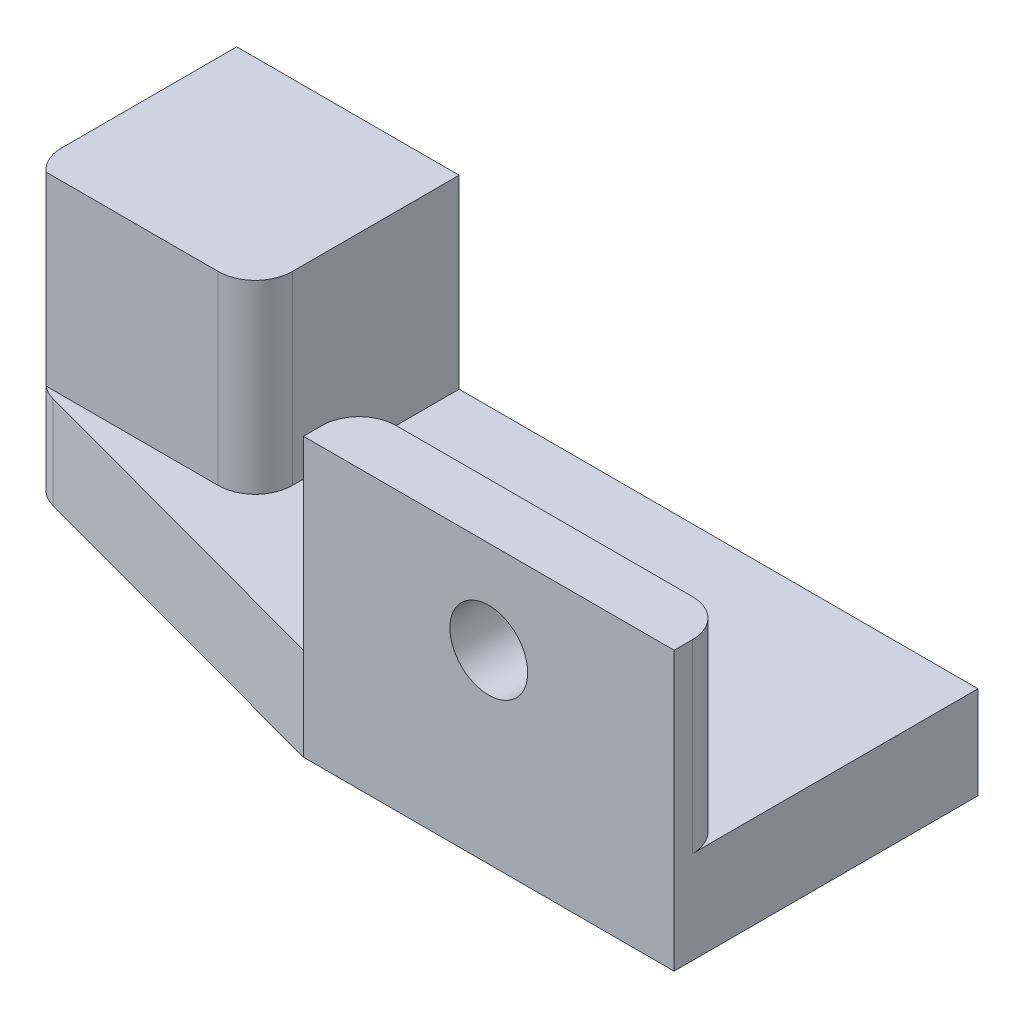
ISO-10303-21;
HEADER;
FILE_DESCRIPTION(('STEP AP214'),'2;1');
FILE_NAME('part.step','',(''),(''),'','','');
FILE_SCHEMA(('AUTOMOTIVE_DESIGN { 1 0 10303 214 1 1 1 1 }'));
ENDSEC;
DATA;
#1=APPLICATION_CONTEXT('core data for automotive mechanical design processes');
#2=APPLICATION_PROTOCOL_DEFINITION('international standard','automotive_design',2000,#1);
#3=PRODUCT_CONTEXT('',#1,'mechanical');
#4=PRODUCT('Part','Part','',(#3));
#5=PRODUCT_RELATED_PRODUCT_CATEGORY('part','',(#4));
#6=PRODUCT_DEFINITION_FORMATION('','',#4);
#7=PRODUCT_DEFINITION_CONTEXT('part definition',#1,'design');
#8=PRODUCT_DEFINITION('design','',#6,#7);
#9=PRODUCT_DEFINITION_SHAPE('','',#8);
#10=(LENGTH_UNIT() NAMED_UNIT(*) SI_UNIT(.MILLI.,.METRE.));
#11=(NAMED_UNIT(*) PLANE_ANGLE_UNIT() SI_UNIT($,.RADIAN.));
#12=(NAMED_UNIT(*) SI_UNIT($,.STERADIAN.) SOLID_ANGLE_UNIT());
#13=UNCERTAINTY_MEASURE_WITH_UNIT(LENGTH_MEASURE(1.E-05),#10,'distance_accuracy_value','');
#14=(GEOMETRIC_REPRESENTATION_CONTEXT(3) GLOBAL_UNCERTAINTY_ASSIGNED_CONTEXT((#13)) GLOBAL_UNIT_ASSIGNED_CONTEXT((#10,
#11,#12)) REPRESENTATION_CONTEXT('',''));
#15=CARTESIAN_POINT('',(0.,0.,0.));
#16=DIRECTION('',(0.,0.,1.));
#17=DIRECTION('',(1.,0.,0.));
#18=AXIS2_PLACEMENT_3D('',#15,#16,#17);
#19=CARTESIAN_POINT('',(0.,5.,0.));
#20=DIRECTION('',(0.,-1.,0.));
#21=DIRECTION('',(0.,0.,1.));
#22=AXIS2_PLACEMENT_3D('',#19,#20,#21);
#23=PLANE('',#22);
#24=CARTESIAN_POINT('',(0.,5.,-8.2));
#25=DIRECTION('',(0.,-1.,0.));
#26=DIRECTION('',(0.,0.,-1.));
#27=AXIS2_PLACEMENT_3D('',#24,#25,#26);
#28=CIRCLE('',#27,2.1);
#29=CARTESIAN_POINT('',(0.,5.,-10.3));
#30=VERTEX_POINT('',#29);
#31=EDGE_CURVE('E206',#30,#30,#28,.T.);
#32=ORIENTED_EDGE('',*,*,#31,.T.);
#33=EDGE_LOOP('',(#32));
#34=FACE_BOUND('',#33,.T.);
#35=DIRECTION('',(-0.965429082558387,0.,-0.260665852290765));
#36=VECTOR('',#35,1.);
#37=CARTESIAN_POINT('',(-20.,5.,-5.40000000000001));
#38=LINE('',#37,#36);
#39=CARTESIAN_POINT('',(0.,5.,0.));
#40=VERTEX_POINT('',#39);
#41=CARTESIAN_POINT('',(-18.5213317045815,5.,-5.00075956023702));
#42=VERTEX_POINT('',#41);
#43=EDGE_CURVE('E212',#40,#42,#38,.T.);
#44=ORIENTED_EDGE('',*,*,#43,.F.);
#45=DIRECTION('',(0.,0.,-1.));
#46=VECTOR('',#45,1.);
#47=CARTESIAN_POINT('',(0.,5.,0.));
#48=LINE('',#47,#46);
#49=CARTESIAN_POINT('',(0.,5.,-1.));
#50=VERTEX_POINT('',#49);
#51=EDGE_CURVE('E178',#40,#50,#48,.T.);
#52=ORIENTED_EDGE('',*,*,#51,.T.);
#53=CARTESIAN_POINT('',(2.,5.,-1.));
#54=DIRECTION('',(0.,1.,0.));
#55=DIRECTION('',(0.,0.,1.));
#56=AXIS2_PLACEMENT_3D('',#53,#54,#55);
#57=CIRCLE('',#56,2.);
#58=CARTESIAN_POINT('',(2.,5.,-3.));
#59=VERTEX_POINT('',#58);
#60=EDGE_CURVE('E11',#59,#50,#57,.T.);
#61=ORIENTED_EDGE('',*,*,#60,.F.);
#62=DIRECTION('',(1.,0.,0.));
#63=VECTOR('',#62,1.);
#64=CARTESIAN_POINT('',(0.,5.,-3.));
#65=LINE('',#64,#63);
#66=CARTESIAN_POINT('',(18.,5.,-3.));
#67=VERTEX_POINT('',#66);
#68=EDGE_CURVE('E181',#59,#67,#65,.T.);
#69=ORIENTED_EDGE('',*,*,#68,.T.);
#70=CARTESIAN_POINT('',(18.,5.,-1.));
#71=DIRECTION('',(0.,1.,0.));
#72=DIRECTION('',(0.,0.,1.));
#73=AXIS2_PLACEMENT_3D('',#70,#71,#72);
#74=CIRCLE('',#73,2.);
#75=CARTESIAN_POINT('',(20.,5.,-1.));
#76=VERTEX_POINT('',#75);
#77=EDGE_CURVE('E49',#76,#67,#74,.T.);
#78=ORIENTED_EDGE('',*,*,#77,.F.);
#79=DIRECTION('',(0.,0.,1.));
#80=VECTOR('',#79,1.);
#81=CARTESIAN_POINT('',(20.,5.,0.));
#82=LINE('',#81,#80);
#83=CARTESIAN_POINT('',(20.,5.,-16.4));
#84=VERTEX_POINT('',#83);
#85=EDGE_CURVE('E217',#84,#76,#82,.T.);
#86=ORIENTED_EDGE('',*,*,#85,.F.);
#87=DIRECTION('',(1.,0.,0.));
#88=VECTOR('',#87,1.);
#89=CARTESIAN_POINT('',(20.,5.,-16.4));
#90=LINE('',#89,#88);
#91=CARTESIAN_POINT('',(-8.,5.,-16.4));
#92=VERTEX_POINT('',#91);
#93=EDGE_CURVE('E214',#92,#84,#90,.T.);
#94=ORIENTED_EDGE('',*,*,#93,.F.);
#95=DIRECTION('',(0.,0.,-1.));
#96=VECTOR('',#95,1.);
#97=CARTESIAN_POINT('',(-8.,5.,0.));
#98=LINE('',#97,#96);
#99=CARTESIAN_POINT('',(-7.99999999999999,5.,-7.40000000000001));
#100=VERTEX_POINT('',#99);
#101=EDGE_CURVE('E186',#100,#92,#98,.T.);
#102=ORIENTED_EDGE('',*,*,#101,.F.);
#103=CARTESIAN_POINT('',(-9.99999999999999,5.,-7.40000000000001));
#104=DIRECTION('',(0.,1.,0.));
#105=DIRECTION('',(0.,0.,1.));
#106=AXIS2_PLACEMENT_3D('',#103,#104,#105);
#107=CIRCLE('',#106,2.);
#108=CARTESIAN_POINT('',(-9.99999999999999,5.,-5.40000000000001));
#109=VERTEX_POINT('',#108);
#110=EDGE_CURVE('E266',#109,#100,#107,.T.);
#111=ORIENTED_EDGE('',*,*,#110,.F.);
#112=DIRECTION('',(1.,0.,0.));
#113=VECTOR('',#112,1.);
#114=CARTESIAN_POINT('',(0.,5.,-5.40000000000001));
#115=LINE('',#114,#113);
#116=CARTESIAN_POINT('',(-19.2861365181745,5.,-5.40000000000001));
#117=VERTEX_POINT('',#116);
#118=EDGE_CURVE('E190',#117,#109,#115,.T.);
#119=ORIENTED_EDGE('',*,*,#118,.F.);
#120=CARTESIAN_POINT('',(-18.,5.,-6.93161772535379));
#121=DIRECTION('',(0.,1.,0.));
#122=DIRECTION('',(0.,0.,1.));
#123=AXIS2_PLACEMENT_3D('',#120,#121,#122);
#124=CIRCLE('',#123,2.);
#125=EDGE_CURVE('E264',#42,#117,#124,.F.);
#126=ORIENTED_EDGE('',*,*,#125,.F.);
#127=EDGE_LOOP('',(#44,#52,#61,#69,#78,#86,#94,#102,#111,#119,#126));
#128=FACE_BOUND('',#127,.T.);
#129=ADVANCED_FACE('F41',(#34,#128),#23,.F.);
#130=CARTESIAN_POINT('',(0.,0.,0.));
#131=DIRECTION('',(0.,-1.,0.));
#132=DIRECTION('',(0.,0.,1.));
#133=AXIS2_PLACEMENT_3D('',#130,#131,#132);
#134=PLANE('',#133);
#135=DIRECTION('',(0.,0.,-1.));
#136=VECTOR('',#135,1.);
#137=CARTESIAN_POINT('',(-20.,0.,-16.4));
#138=LINE('',#137,#136);
#139=CARTESIAN_POINT('',(-20.,0.,-6.93161772535379));
#140=VERTEX_POINT('',#139);
#141=CARTESIAN_POINT('',(-20.,0.,-16.4));
#142=VERTEX_POINT('',#141);
#143=EDGE_CURVE('E221',#140,#142,#138,.T.);
#144=ORIENTED_EDGE('',*,*,#143,.T.);
#145=DIRECTION('',(1.,0.,0.));
#146=VECTOR('',#145,1.);
#147=CARTESIAN_POINT('',(20.,0.,-16.4));
#148=LINE('',#147,#146);
#149=CARTESIAN_POINT('',(20.,0.,-16.4));
#150=VERTEX_POINT('',#149);
#151=EDGE_CURVE('E224',#142,#150,#148,.T.);
#152=ORIENTED_EDGE('',*,*,#151,.T.);
#153=DIRECTION('',(0.,0.,1.));
#154=VECTOR('',#153,1.);
#155=CARTESIAN_POINT('',(20.,0.,0.));
#156=LINE('',#155,#154);
#157=CARTESIAN_POINT('',(20.,0.,0.));
#158=VERTEX_POINT('',#157);
#159=EDGE_CURVE('E227',#150,#158,#156,.T.);
#160=ORIENTED_EDGE('',*,*,#159,.T.);
#161=DIRECTION('',(-1.,0.,0.));
#162=VECTOR('',#161,1.);
#163=CARTESIAN_POINT('',(0.,0.,0.));
#164=LINE('',#163,#162);
#165=CARTESIAN_POINT('',(0.,0.,0.));
#166=VERTEX_POINT('',#165);
#167=EDGE_CURVE('E161',#158,#166,#164,.T.);
#168=ORIENTED_EDGE('',*,*,#167,.T.);
#169=DIRECTION('',(-0.965429082558387,0.,-0.260665852290765));
#170=VECTOR('',#169,1.);
#171=CARTESIAN_POINT('',(-20.,0.,-5.40000000000001));
#172=LINE('',#171,#170);
#173=CARTESIAN_POINT('',(-18.5213317045815,0.,-5.00075956023702));
#174=VERTEX_POINT('',#173);
#175=EDGE_CURVE('E209',#166,#174,#172,.T.);
#176=ORIENTED_EDGE('',*,*,#175,.T.);
#177=CARTESIAN_POINT('',(-18.,0.,-6.93161772535379));
#178=DIRECTION('',(0.,1.,0.));
#179=DIRECTION('',(0.,0.,1.));
#180=AXIS2_PLACEMENT_3D('',#177,#178,#179);
#181=CIRCLE('',#180,2.);
#182=EDGE_CURVE('E261',#140,#174,#181,.T.);
#183=ORIENTED_EDGE('',*,*,#182,.F.);
#184=EDGE_LOOP('',(#144,#152,#160,#168,#176,#183));
#185=FACE_BOUND('',#184,.T.);
#186=CARTESIAN_POINT('',(0.,0.,-8.2));
#187=DIRECTION('',(0.,-1.,0.));
#188=DIRECTION('',(0.,0.,-1.));
#189=AXIS2_PLACEMENT_3D('',#186,#187,#188);
#190=CIRCLE('',#189,2.1);
#191=CARTESIAN_POINT('',(0.,0.,-10.3));
#192=VERTEX_POINT('',#191);
#193=EDGE_CURVE('E205',#192,#192,#190,.T.);
#194=ORIENTED_EDGE('',*,*,#193,.F.);
#195=EDGE_LOOP('',(#194));
#196=FACE_BOUND('',#195,.T.);
#197=ADVANCED_FACE('F321',(#185,#196),#134,.T.);
#198=CARTESIAN_POINT('',(-20.,5.,-5.40000000000001));
#199=DIRECTION('',(0.260665852290765,0.,-0.965429082558387));
#200=DIRECTION('',(0.965429082558387,0.,0.260665852290765));
#201=AXIS2_PLACEMENT_3D('',#198,#199,#200);
#202=PLANE('',#201);
#203=ORIENTED_EDGE('',*,*,#175,.F.);
#204=DIRECTION('',(0.,-1.,0.));
#205=VECTOR('',#204,1.);
#206=CARTESIAN_POINT('',(0.,5.,0.));
#207=LINE('',#206,#205);
#208=EDGE_CURVE('E166',#40,#166,#207,.T.);
#209=ORIENTED_EDGE('',*,*,#208,.F.);
#210=ORIENTED_EDGE('',*,*,#43,.T.);
#211=DIRECTION('',(0.,-1.,0.));
#212=VECTOR('',#211,1.);
#213=CARTESIAN_POINT('',(-18.5213317045815,5.,-5.00075956023702));
#214=LINE('',#213,#212);
#215=EDGE_CURVE('E56',#174,#42,#214,.F.);
#216=ORIENTED_EDGE('',*,*,#215,.F.);
#217=EDGE_LOOP('',(#203,#209,#210,#216));
#218=FACE_BOUND('',#217,.T.);
#219=ADVANCED_FACE('F327',(#218),#202,.F.);
#220=CARTESIAN_POINT('',(-20.,5.,-16.4));
#221=DIRECTION('',(1.,0.,0.));
#222=DIRECTION('',(0.,0.,1.));
#223=AXIS2_PLACEMENT_3D('',#220,#221,#222);
#224=PLANE('',#223);
#225=DIRECTION('',(0.,0.,-1.));
#226=VECTOR('',#225,1.);
#227=CARTESIAN_POINT('',(-20.,15.,0.));
#228=LINE('',#227,#226);
#229=CARTESIAN_POINT('',(-20.,15.,-6.93161772535379));
#230=VERTEX_POINT('',#229);
#231=CARTESIAN_POINT('',(-20.,15.,-16.4));
#232=VERTEX_POINT('',#231);
#233=EDGE_CURVE('E193',#230,#232,#228,.T.);
#234=ORIENTED_EDGE('',*,*,#233,.T.);
#235=DIRECTION('',(0.,-1.,0.));
#236=VECTOR('',#235,1.);
#237=CARTESIAN_POINT('',(-20.,5.,-16.4));
#238=LINE('',#237,#236);
#239=EDGE_CURVE('E232',#232,#142,#238,.T.);
#240=ORIENTED_EDGE('',*,*,#239,.T.);
#241=ORIENTED_EDGE('',*,*,#143,.F.);
#242=DIRECTION('',(0.,-1.,0.));
#243=VECTOR('',#242,1.);
#244=CARTESIAN_POINT('',(-20.,5.,-6.93161772535379));
#245=LINE('',#244,#243);
#246=EDGE_CURVE('E259',#230,#140,#245,.T.);
#247=ORIENTED_EDGE('',*,*,#246,.F.);
#248=EDGE_LOOP('',(#234,#240,#241,#247));
#249=FACE_BOUND('',#248,.T.);
#250=ADVANCED_FACE('F361',(#249),#224,.F.);
#251=CARTESIAN_POINT('',(20.,5.,-16.4));
#252=DIRECTION('',(0.,0.,1.));
#253=DIRECTION('',(-1.,0.,0.));
#254=AXIS2_PLACEMENT_3D('',#251,#252,#253);
#255=PLANE('',#254);
#256=CARTESIAN_POINT('',(-14.,10.,-16.4));
#257=DIRECTION('',(0.,0.,1.));
#258=DIRECTION('',(1.,0.,0.));
#259=AXIS2_PLACEMENT_3D('',#256,#257,#258);
#260=CIRCLE('',#259,2.8);
#261=CARTESIAN_POINT('',(-11.2,10.,-16.4));
#262=VERTEX_POINT('',#261);
#263=EDGE_CURVE('E286',#262,#262,#260,.T.);
#264=ORIENTED_EDGE('',*,*,#263,.T.);
#265=EDGE_LOOP('',(#264));
#266=FACE_BOUND('',#265,.T.);
#267=ORIENTED_EDGE('',*,*,#151,.F.);
#268=ORIENTED_EDGE('',*,*,#239,.F.);
#269=DIRECTION('',(1.,0.,0.));
#270=VECTOR('',#269,1.);
#271=CARTESIAN_POINT('',(0.,15.,-16.4));
#272=LINE('',#271,#270);
#273=CARTESIAN_POINT('',(-8.,15.,-16.4));
#274=VERTEX_POINT('',#273);
#275=EDGE_CURVE('E196',#232,#274,#272,.T.);
#276=ORIENTED_EDGE('',*,*,#275,.T.);
#277=DIRECTION('',(0.,-1.,0.));
#278=VECTOR('',#277,1.);
#279=CARTESIAN_POINT('',(-8.,15.,-16.4));
#280=LINE('',#279,#278);
#281=EDGE_CURVE('E199',#274,#92,#280,.T.);
#282=ORIENTED_EDGE('',*,*,#281,.T.);
#283=ORIENTED_EDGE('',*,*,#93,.T.);
#284=DIRECTION('',(0.,-1.,0.));
#285=VECTOR('',#284,1.);
#286=CARTESIAN_POINT('',(20.,5.,-16.4));
#287=LINE('',#286,#285);
#288=EDGE_CURVE('E165',#84,#150,#287,.T.);
#289=ORIENTED_EDGE('',*,*,#288,.T.);
#290=EDGE_LOOP('',(#267,#268,#276,#282,#283,#289));
#291=FACE_BOUND('',#290,.T.);
#292=ADVANCED_FACE('F317',(#266,#291),#255,.F.);
#293=CARTESIAN_POINT('',(20.,5.,0.));
#294=DIRECTION('',(-1.,0.,0.));
#295=DIRECTION('',(0.,0.,-1.));
#296=AXIS2_PLACEMENT_3D('',#293,#294,#295);
#297=PLANE('',#296);
#298=DIRECTION('',(0.,0.,1.));
#299=VECTOR('',#298,1.);
#300=CARTESIAN_POINT('',(20.,15.,0.));
#301=LINE('',#300,#299);
#302=CARTESIAN_POINT('',(20.,15.,-1.));
#303=VERTEX_POINT('',#302);
#304=CARTESIAN_POINT('',(20.,15.,0.));
#305=VERTEX_POINT('',#304);
#306=EDGE_CURVE('E150',#303,#305,#301,.T.);
#307=ORIENTED_EDGE('',*,*,#306,.T.);
#308=DIRECTION('',(0.,-1.,0.));
#309=VECTOR('',#308,1.);
#310=CARTESIAN_POINT('',(20.,5.,0.));
#311=LINE('',#310,#309);
#312=EDGE_CURVE('E158',#305,#158,#311,.T.);
#313=ORIENTED_EDGE('',*,*,#312,.T.);
#314=ORIENTED_EDGE('',*,*,#159,.F.);
#315=ORIENTED_EDGE('',*,*,#288,.F.);
#316=ORIENTED_EDGE('',*,*,#85,.T.);
#317=DIRECTION('',(0.,-1.,0.));
#318=VECTOR('',#317,1.);
#319=CARTESIAN_POINT('',(20.,5.,-1.));
#320=LINE('',#319,#318);
#321=EDGE_CURVE('E171',#303,#76,#320,.T.);
#322=ORIENTED_EDGE('',*,*,#321,.F.);
#323=EDGE_LOOP('',(#307,#313,#314,#315,#316,#322));
#324=FACE_BOUND('',#323,.T.);
#325=ADVANCED_FACE('F169',(#324),#297,.F.);
#326=CARTESIAN_POINT('',(0.,5.,0.));
#327=DIRECTION('',(0.,0.,-1.));
#328=DIRECTION('',(1.,0.,0.));
#329=AXIS2_PLACEMENT_3D('',#326,#327,#328);
#330=PLANE('',#329);
#331=CARTESIAN_POINT('',(10.,10.,0.));
#332=DIRECTION('',(0.,0.,1.));
#333=DIRECTION('',(1.,0.,0.));
#334=AXIS2_PLACEMENT_3D('',#331,#332,#333);
#335=CIRCLE('',#334,2.1);
#336=CARTESIAN_POINT('',(12.1,10.,0.));
#337=VERTEX_POINT('',#336);
#338=EDGE_CURVE('E289',#337,#337,#335,.T.);
#339=ORIENTED_EDGE('',*,*,#338,.F.);
#340=EDGE_LOOP('',(#339));
#341=FACE_BOUND('',#340,.T.);
#342=ORIENTED_EDGE('',*,*,#167,.F.);
#343=ORIENTED_EDGE('',*,*,#312,.F.);
#344=DIRECTION('',(-1.,0.,0.));
#345=VECTOR('',#344,1.);
#346=CARTESIAN_POINT('',(0.,15.,0.));
#347=LINE('',#346,#345);
#348=CARTESIAN_POINT('',(0.,15.,0.));
#349=VERTEX_POINT('',#348);
#350=EDGE_CURVE('E145',#305,#349,#347,.T.);
#351=ORIENTED_EDGE('',*,*,#350,.T.);
#352=DIRECTION('',(0.,-1.,0.));
#353=VECTOR('',#352,1.);
#354=CARTESIAN_POINT('',(0.,15.,0.));
#355=LINE('',#354,#353);
#356=EDGE_CURVE('E155',#349,#40,#355,.T.);
#357=ORIENTED_EDGE('',*,*,#356,.T.);
#358=ORIENTED_EDGE('',*,*,#208,.T.);
#359=EDGE_LOOP('',(#342,#343,#351,#357,#358));
#360=FACE_BOUND('',#359,.T.);
#361=ADVANCED_FACE('F159',(#341,#360),#330,.F.);
#362=CARTESIAN_POINT('',(0.,5.,-8.2));
#363=DIRECTION('',(0.,-1.,0.));
#364=DIRECTION('',(0.,0.,1.));
#365=AXIS2_PLACEMENT_3D('',#362,#363,#364);
#366=CYLINDRICAL_SURFACE('',#365,2.1);
#367=ORIENTED_EDGE('',*,*,#31,.F.);
#368=EDGE_LOOP('',(#367));
#369=FACE_BOUND('',#368,.T.);
#370=ORIENTED_EDGE('',*,*,#193,.T.);
#371=EDGE_LOOP('',(#370));
#372=FACE_BOUND('',#371,.T.);
#373=ADVANCED_FACE('F308',(#369,#372),#366,.F.);
#374=CARTESIAN_POINT('',(-8.,15.,0.));
#375=DIRECTION('',(1.,0.,0.));
#376=DIRECTION('',(0.,0.,1.));
#377=AXIS2_PLACEMENT_3D('',#374,#375,#376);
#378=PLANE('',#377);
#379=ORIENTED_EDGE('',*,*,#101,.T.);
#380=ORIENTED_EDGE('',*,*,#281,.F.);
#381=DIRECTION('',(0.,0.,-1.));
#382=VECTOR('',#381,1.);
#383=CARTESIAN_POINT('',(-8.,15.,0.));
#384=LINE('',#383,#382);
#385=CARTESIAN_POINT('',(-7.99999999999999,15.,-7.40000000000001));
#386=VERTEX_POINT('',#385);
#387=EDGE_CURVE('E187',#386,#274,#384,.T.);
#388=ORIENTED_EDGE('',*,*,#387,.F.);
#389=DIRECTION('',(0.,-1.,0.));
#390=VECTOR('',#389,1.);
#391=CARTESIAN_POINT('',(-7.99999999999999,15.,-7.40000000000001));
#392=LINE('',#391,#390);
#393=EDGE_CURVE('E239',#100,#386,#392,.F.);
#394=ORIENTED_EDGE('',*,*,#393,.F.);
#395=EDGE_LOOP('',(#379,#380,#388,#394));
#396=FACE_BOUND('',#395,.T.);
#397=ADVANCED_FACE('F314',(#396),#378,.T.);
#398=CARTESIAN_POINT('',(0.,15.,-5.40000000000001));
#399=DIRECTION('',(0.,0.,1.));
#400=DIRECTION('',(-1.,0.,0.));
#401=AXIS2_PLACEMENT_3D('',#398,#399,#400);
#402=PLANE('',#401);
#403=DIRECTION('',(1.,0.,0.));
#404=VECTOR('',#403,1.);
#405=CARTESIAN_POINT('',(0.,15.,-5.40000000000001));
#406=LINE('',#405,#404);
#407=CARTESIAN_POINT('',(-19.2861365181745,15.,-5.40000000000001));
#408=VERTEX_POINT('',#407);
#409=CARTESIAN_POINT('',(-9.99999999999999,15.,-5.40000000000001));
#410=VERTEX_POINT('',#409);
#411=EDGE_CURVE('E189',#408,#410,#406,.T.);
#412=ORIENTED_EDGE('',*,*,#411,.F.);
#413=DIRECTION('',(0.,-1.,0.));
#414=VECTOR('',#413,1.);
#415=CARTESIAN_POINT('',(-19.2861365181745,5.,-5.40000000000001));
#416=LINE('',#415,#414);
#417=EDGE_CURVE('E234',#117,#408,#416,.F.);
#418=ORIENTED_EDGE('',*,*,#417,.F.);
#419=ORIENTED_EDGE('',*,*,#118,.T.);
#420=DIRECTION('',(0.,-1.,0.));
#421=VECTOR('',#420,1.);
#422=CARTESIAN_POINT('',(-9.99999999999999,15.,-5.40000000000001));
#423=LINE('',#422,#421);
#424=EDGE_CURVE('E237',#410,#109,#423,.T.);
#425=ORIENTED_EDGE('',*,*,#424,.F.);
#426=EDGE_LOOP('',(#412,#418,#419,#425));
#427=FACE_BOUND('',#426,.T.);
#428=ADVANCED_FACE('F332',(#427),#402,.T.);
#429=CARTESIAN_POINT('',(0.,15.,0.));
#430=DIRECTION('',(0.,1.,0.));
#431=DIRECTION('',(0.,0.,-1.));
#432=AXIS2_PLACEMENT_3D('',#429,#430,#431);
#433=PLANE('',#432);
#434=ORIENTED_EDGE('',*,*,#387,.T.);
#435=ORIENTED_EDGE('',*,*,#275,.F.);
#436=ORIENTED_EDGE('',*,*,#233,.F.);
#437=CARTESIAN_POINT('',(-18.,15.,-6.93161772535379));
#438=DIRECTION('',(0.,-1.,0.));
#439=DIRECTION('',(0.,0.,-1.));
#440=AXIS2_PLACEMENT_3D('',#437,#438,#439);
#441=CIRCLE('',#440,2.);
#442=EDGE_CURVE('E242',#408,#230,#441,.T.);
#443=ORIENTED_EDGE('',*,*,#442,.F.);
#444=ORIENTED_EDGE('',*,*,#411,.T.);
#445=CARTESIAN_POINT('',(-9.99999999999999,15.,-7.40000000000001));
#446=DIRECTION('',(0.,-1.,0.));
#447=DIRECTION('',(0.,0.,-1.));
#448=AXIS2_PLACEMENT_3D('',#445,#446,#447);
#449=CIRCLE('',#448,2.);
#450=EDGE_CURVE('E244',#386,#410,#449,.T.);
#451=ORIENTED_EDGE('',*,*,#450,.F.);
#452=EDGE_LOOP('',(#434,#435,#436,#443,#444,#451));
#453=FACE_BOUND('',#452,.T.);
#454=ADVANCED_FACE('F336',(#453),#433,.T.);
#455=CARTESIAN_POINT('',(0.,15.,0.));
#456=DIRECTION('',(1.,0.,0.));
#457=DIRECTION('',(0.,0.,1.));
#458=AXIS2_PLACEMENT_3D('',#455,#456,#457);
#459=PLANE('',#458);
#460=ORIENTED_EDGE('',*,*,#51,.F.);
#461=ORIENTED_EDGE('',*,*,#356,.F.);
#462=DIRECTION('',(0.,0.,-1.));
#463=VECTOR('',#462,1.);
#464=CARTESIAN_POINT('',(0.,15.,0.));
#465=LINE('',#464,#463);
#466=CARTESIAN_POINT('',(0.,15.,-1.));
#467=VERTEX_POINT('',#466);
#468=EDGE_CURVE('E152',#349,#467,#465,.T.);
#469=ORIENTED_EDGE('',*,*,#468,.T.);
#470=DIRECTION('',(0.,-1.,0.));
#471=VECTOR('',#470,1.);
#472=CARTESIAN_POINT('',(0.,15.,-1.));
#473=LINE('',#472,#471);
#474=EDGE_CURVE('E256',#50,#467,#473,.F.);
#475=ORIENTED_EDGE('',*,*,#474,.F.);
#476=EDGE_LOOP('',(#460,#461,#469,#475));
#477=FACE_BOUND('',#476,.T.);
#478=ADVANCED_FACE('F284',(#477),#459,.F.);
#479=CARTESIAN_POINT('',(0.,15.,-3.));
#480=DIRECTION('',(0.,0.,1.));
#481=DIRECTION('',(-1.,0.,0.));
#482=AXIS2_PLACEMENT_3D('',#479,#480,#481);
#483=PLANE('',#482);
#484=CARTESIAN_POINT('',(10.,10.,-3.));
#485=DIRECTION('',(0.,0.,1.));
#486=DIRECTION('',(1.,0.,0.));
#487=AXIS2_PLACEMENT_3D('',#484,#485,#486);
#488=CIRCLE('',#487,2.1);
#489=CARTESIAN_POINT('',(12.1,10.,-3.));
#490=VERTEX_POINT('',#489);
#491=EDGE_CURVE('E294',#490,#490,#488,.T.);
#492=ORIENTED_EDGE('',*,*,#491,.T.);
#493=EDGE_LOOP('',(#492));
#494=FACE_BOUND('',#493,.T.);
#495=ORIENTED_EDGE('',*,*,#68,.F.);
#496=DIRECTION('',(0.,-1.,0.));
#497=VECTOR('',#496,1.);
#498=CARTESIAN_POINT('',(2.,15.,-3.));
#499=LINE('',#498,#497);
#500=CARTESIAN_POINT('',(2.,15.,-3.));
#501=VERTEX_POINT('',#500);
#502=EDGE_CURVE('E247',#501,#59,#499,.T.);
#503=ORIENTED_EDGE('',*,*,#502,.F.);
#504=DIRECTION('',(1.,0.,0.));
#505=VECTOR('',#504,1.);
#506=CARTESIAN_POINT('',(0.,15.,-3.));
#507=LINE('',#506,#505);
#508=CARTESIAN_POINT('',(18.,15.,-3.));
#509=VERTEX_POINT('',#508);
#510=EDGE_CURVE('E172',#501,#509,#507,.T.);
#511=ORIENTED_EDGE('',*,*,#510,.T.);
#512=DIRECTION('',(0.,-1.,0.));
#513=VECTOR('',#512,1.);
#514=CARTESIAN_POINT('',(18.,15.,-3.));
#515=LINE('',#514,#513);
#516=EDGE_CURVE('E249',#67,#509,#515,.F.);
#517=ORIENTED_EDGE('',*,*,#516,.F.);
#518=EDGE_LOOP('',(#495,#503,#511,#517));
#519=FACE_BOUND('',#518,.T.);
#520=ADVANCED_FACE('F279',(#494,#519),#483,.F.);
#521=CARTESIAN_POINT('',(0.,15.,0.));
#522=DIRECTION('',(0.,1.,0.));
#523=DIRECTION('',(0.,0.,-1.));
#524=AXIS2_PLACEMENT_3D('',#521,#522,#523);
#525=PLANE('',#524);
#526=ORIENTED_EDGE('',*,*,#510,.F.);
#527=CARTESIAN_POINT('',(2.,15.,-1.));
#528=DIRECTION('',(0.,-1.,0.));
#529=DIRECTION('',(0.,0.,-1.));
#530=AXIS2_PLACEMENT_3D('',#527,#528,#529);
#531=CIRCLE('',#530,2.);
#532=EDGE_CURVE('E252',#467,#501,#531,.T.);
#533=ORIENTED_EDGE('',*,*,#532,.F.);
#534=ORIENTED_EDGE('',*,*,#468,.F.);
#535=ORIENTED_EDGE('',*,*,#350,.F.);
#536=ORIENTED_EDGE('',*,*,#306,.F.);
#537=CARTESIAN_POINT('',(18.,15.,-1.));
#538=DIRECTION('',(0.,-1.,0.));
#539=DIRECTION('',(0.,0.,-1.));
#540=AXIS2_PLACEMENT_3D('',#537,#538,#539);
#541=CIRCLE('',#540,2.);
#542=EDGE_CURVE('E254',#509,#303,#541,.T.);
#543=ORIENTED_EDGE('',*,*,#542,.F.);
#544=EDGE_LOOP('',(#526,#533,#534,#535,#536,#543));
#545=FACE_BOUND('',#544,.T.);
#546=ADVANCED_FACE('F148',(#545),#525,.T.);
#547=CARTESIAN_POINT('',(-14.,10.,-7.3));
#548=DIRECTION('',(0.,0.,-1.));
#549=DIRECTION('',(1.,0.,0.));
#550=AXIS2_PLACEMENT_3D('',#547,#548,#549);
#551=CYLINDRICAL_SURFACE('',#550,2.8);
#552=CARTESIAN_POINT('',(-14.,10.,-7.3));
#553=DIRECTION('',(0.,0.,1.));
#554=DIRECTION('',(1.,0.,0.));
#555=AXIS2_PLACEMENT_3D('',#552,#553,#554);
#556=CIRCLE('',#555,2.8);
#557=CARTESIAN_POINT('',(-11.2,10.,-7.3));
#558=VERTEX_POINT('',#557);
#559=EDGE_CURVE('E182',#558,#558,#556,.T.);
#560=ORIENTED_EDGE('',*,*,#559,.T.);
#561=EDGE_LOOP('',(#560));
#562=FACE_BOUND('',#561,.T.);
#563=ORIENTED_EDGE('',*,*,#263,.F.);
#564=EDGE_LOOP('',(#563));
#565=FACE_BOUND('',#564,.T.);
#566=ADVANCED_FACE('F347',(#562,#565),#551,.F.);
#567=CARTESIAN_POINT('',(-14.,10.,-7.3));
#568=DIRECTION('',(0.,0.,-1.));
#569=DIRECTION('',(1.,0.,0.));
#570=AXIS2_PLACEMENT_3D('',#567,#568,#569);
#571=PLANE('',#570);
#572=ORIENTED_EDGE('',*,*,#559,.F.);
#573=EDGE_LOOP('',(#572));
#574=FACE_BOUND('',#573,.T.);
#575=ADVANCED_FACE('F303',(#574),#571,.T.);
#576=CARTESIAN_POINT('',(10.,10.,6.1));
#577=DIRECTION('',(0.,0.,-1.));
#578=DIRECTION('',(1.,0.,0.));
#579=AXIS2_PLACEMENT_3D('',#576,#577,#578);
#580=CYLINDRICAL_SURFACE('',#579,2.1);
#581=ORIENTED_EDGE('',*,*,#491,.F.);
#582=EDGE_LOOP('',(#581));
#583=FACE_BOUND('',#582,.T.);
#584=ORIENTED_EDGE('',*,*,#338,.T.);
#585=EDGE_LOOP('',(#584));
#586=FACE_BOUND('',#585,.T.);
#587=ADVANCED_FACE('F299',(#583,#586),#580,.F.);
#588=CARTESIAN_POINT('',(-9.99999999999999,15.,-7.40000000000001));
#589=DIRECTION('',(0.,-1.,0.));
#590=DIRECTION('',(0.,0.,1.));
#591=AXIS2_PLACEMENT_3D('',#588,#589,#590);
#592=CYLINDRICAL_SURFACE('',#591,2.);
#593=ORIENTED_EDGE('',*,*,#450,.T.);
#594=ORIENTED_EDGE('',*,*,#424,.T.);
#595=ORIENTED_EDGE('',*,*,#110,.T.);
#596=ORIENTED_EDGE('',*,*,#393,.T.);
#597=EDGE_LOOP('',(#593,#594,#595,#596));
#598=FACE_BOUND('',#597,.T.);
#599=ADVANCED_FACE('F302',(#598),#592,.T.);
#600=CARTESIAN_POINT('',(18.,5.,-1.));
#601=DIRECTION('',(0.,-1.,0.));
#602=DIRECTION('',(0.,0.,1.));
#603=AXIS2_PLACEMENT_3D('',#600,#601,#602);
#604=CYLINDRICAL_SURFACE('',#603,2.);
#605=ORIENTED_EDGE('',*,*,#542,.T.);
#606=ORIENTED_EDGE('',*,*,#321,.T.);
#607=ORIENTED_EDGE('',*,*,#77,.T.);
#608=ORIENTED_EDGE('',*,*,#516,.T.);
#609=EDGE_LOOP('',(#605,#606,#607,#608));
#610=FACE_BOUND('',#609,.T.);
#611=ADVANCED_FACE('F271',(#610),#604,.T.);
#612=CARTESIAN_POINT('',(2.,15.,-1.));
#613=DIRECTION('',(0.,-1.,0.));
#614=DIRECTION('',(0.,0.,1.));
#615=AXIS2_PLACEMENT_3D('',#612,#613,#614);
#616=CYLINDRICAL_SURFACE('',#615,2.);
#617=ORIENTED_EDGE('',*,*,#532,.T.);
#618=ORIENTED_EDGE('',*,*,#502,.T.);
#619=ORIENTED_EDGE('',*,*,#60,.T.);
#620=ORIENTED_EDGE('',*,*,#474,.T.);
#621=EDGE_LOOP('',(#617,#618,#619,#620));
#622=FACE_BOUND('',#621,.T.);
#623=ADVANCED_FACE('F281',(#622),#616,.T.);
#624=CARTESIAN_POINT('',(-18.,5.,-6.93161772535379));
#625=DIRECTION('',(0.,-1.,0.));
#626=DIRECTION('',(0.,0.,1.));
#627=AXIS2_PLACEMENT_3D('',#624,#625,#626);
#628=CYLINDRICAL_SURFACE('',#627,2.);
#629=ORIENTED_EDGE('',*,*,#125,.T.);
#630=ORIENTED_EDGE('',*,*,#417,.T.);
#631=ORIENTED_EDGE('',*,*,#442,.T.);
#632=ORIENTED_EDGE('',*,*,#246,.T.);
#633=ORIENTED_EDGE('',*,*,#182,.T.);
#634=ORIENTED_EDGE('',*,*,#215,.T.);
#635=EDGE_LOOP('',(#629,#630,#631,#632,#633,#634));
#636=FACE_BOUND('',#635,.T.);
#637=ADVANCED_FACE('F43',(#636),#628,.T.);
#638=CLOSED_SHELL('',(#129,#197,#219,#250,#292,#325,#361,#373,#397,#428,#454,#478,#520,#546,
#566,#575,#587,#599,#611,#623,#637));
#639=MANIFOLD_SOLID_BREP('B2',#638);
#640=ADVANCED_BREP_SHAPE_REPRESENTATION('',(#18,#639),#14);
#641=SHAPE_DEFINITION_REPRESENTATION(#9,#640);
ENDSEC;
END-ISO-10303-21;
